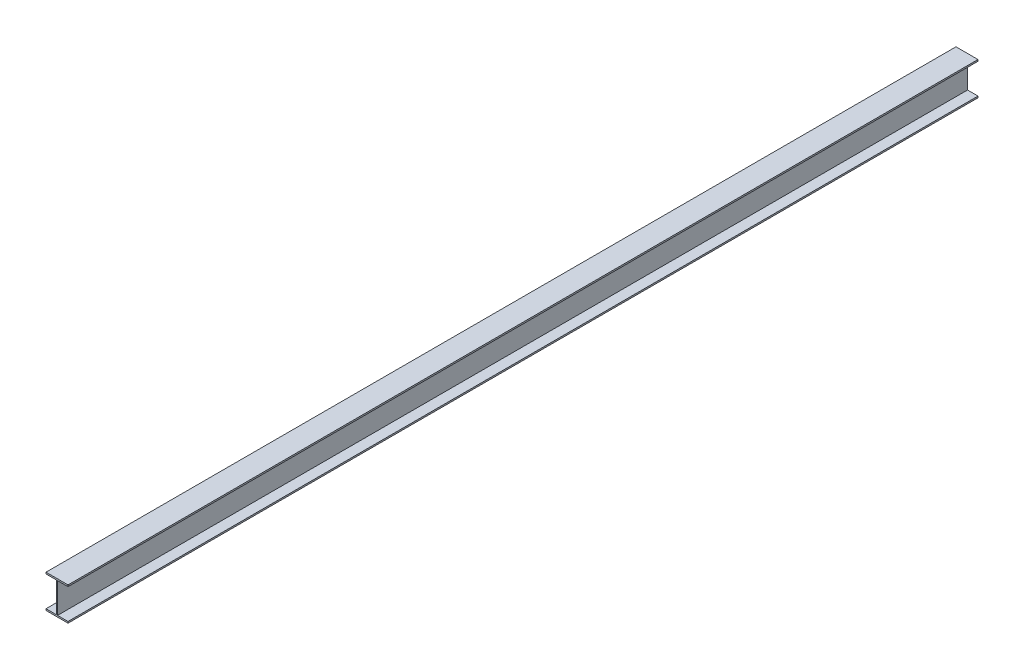
ISO-10303-21;
HEADER;
FILE_DESCRIPTION(('STEP AP214'),'2;1');
FILE_NAME('part.step','',(''),(''),'','','');
FILE_SCHEMA(('AUTOMOTIVE_DESIGN { 1 0 10303 214 1 1 1 1 }'));
ENDSEC;
DATA;
#1=APPLICATION_CONTEXT('core data for automotive mechanical design processes');
#2=APPLICATION_PROTOCOL_DEFINITION('international standard','automotive_design',2000,#1);
#3=PRODUCT_CONTEXT('',#1,'mechanical');
#4=PRODUCT('Part','Part','',(#3));
#5=PRODUCT_RELATED_PRODUCT_CATEGORY('part','',(#4));
#6=PRODUCT_DEFINITION_FORMATION('','',#4);
#7=PRODUCT_DEFINITION_CONTEXT('part definition',#1,'design');
#8=PRODUCT_DEFINITION('design','',#6,#7);
#9=PRODUCT_DEFINITION_SHAPE('','',#8);
#10=(LENGTH_UNIT() NAMED_UNIT(*) SI_UNIT(.MILLI.,.METRE.));
#11=(NAMED_UNIT(*) PLANE_ANGLE_UNIT() SI_UNIT($,.RADIAN.));
#12=(NAMED_UNIT(*) SI_UNIT($,.STERADIAN.) SOLID_ANGLE_UNIT());
#13=UNCERTAINTY_MEASURE_WITH_UNIT(LENGTH_MEASURE(1.E-05),#10,'distance_accuracy_value','');
#14=(GEOMETRIC_REPRESENTATION_CONTEXT(3) GLOBAL_UNCERTAINTY_ASSIGNED_CONTEXT((#13)) GLOBAL_UNIT_ASSIGNED_CONTEXT((#10,
#11,#12)) REPRESENTATION_CONTEXT('',''));
#15=CARTESIAN_POINT('',(0.,0.,0.));
#16=DIRECTION('',(0.,0.,1.));
#17=DIRECTION('',(1.,0.,0.));
#18=AXIS2_PLACEMENT_3D('',#15,#16,#17);
#19=CARTESIAN_POINT('',(101.6,-153.162240532958,4200.));
#20=DIRECTION('',(0.,1.,0.));
#21=DIRECTION('',(0.,0.,1.));
#22=AXIS2_PLACEMENT_3D('',#19,#20,#21);
#23=PLANE('',#22);
#24=DIRECTION('',(-1.,0.,0.));
#25=VECTOR('',#24,1.);
#26=CARTESIAN_POINT('',(101.6,-153.162240532958,2252.4));
#27=LINE('',#26,#25);
#28=CARTESIAN_POINT('',(101.6,-153.162240532958,2252.4));
#29=VERTEX_POINT('',#28);
#30=CARTESIAN_POINT('',(0.,-153.162240532958,2252.4));
#31=VERTEX_POINT('',#30);
#32=EDGE_CURVE('E11',#29,#31,#27,.T.);
#33=ORIENTED_EDGE('',*,*,#32,.F.);
#34=DIRECTION('',(0.,0.,-1.));
#35=VECTOR('',#34,1.);
#36=CARTESIAN_POINT('',(101.6,-153.162240532958,4200.));
#37=LINE('',#36,#35);
#38=CARTESIAN_POINT('',(101.6,-153.162240532958,4200.));
#39=VERTEX_POINT('',#38);
#40=EDGE_CURVE('E179',#39,#29,#37,.T.);
#41=ORIENTED_EDGE('',*,*,#40,.F.);
#42=DIRECTION('',(1.,0.,0.));
#43=VECTOR('',#42,1.);
#44=CARTESIAN_POINT('',(101.6,-153.162240532958,4200.));
#45=LINE('',#44,#43);
#46=CARTESIAN_POINT('',(0.,-153.162240532958,4200.));
#47=VERTEX_POINT('',#46);
#48=EDGE_CURVE('E236',#47,#39,#45,.T.);
#49=ORIENTED_EDGE('',*,*,#48,.F.);
#50=DIRECTION('',(0.,0.,-1.));
#51=VECTOR('',#50,1.);
#52=CARTESIAN_POINT('',(0.,-153.162240532958,4200.));
#53=LINE('',#52,#51);
#54=EDGE_CURVE('E174',#47,#31,#53,.T.);
#55=ORIENTED_EDGE('',*,*,#54,.T.);
#56=EDGE_LOOP('',(#33,#41,#49,#55));
#57=FACE_BOUND('',#56,.T.);
#58=ADVANCED_FACE('F37',(#57),#23,.F.);
#59=DIRECTION('',(1.,0.,0.));
#60=VECTOR('',#59,1.);
#61=CARTESIAN_POINT('',(101.6,-153.162240532958,1947.6));
#62=LINE('',#61,#60);
#63=CARTESIAN_POINT('',(0.,-153.162240532958,1947.6));
#64=VERTEX_POINT('',#63);
#65=CARTESIAN_POINT('',(101.6,-153.162240532958,1947.6));
#66=VERTEX_POINT('',#65);
#67=EDGE_CURVE('E46',#64,#66,#62,.T.);
#68=ORIENTED_EDGE('',*,*,#67,.F.);
#69=CARTESIAN_POINT('',(0.,-153.162240532958,0.));
#70=VERTEX_POINT('',#69);
#71=EDGE_CURVE('E178',#64,#70,#53,.T.);
#72=ORIENTED_EDGE('',*,*,#71,.T.);
#73=DIRECTION('',(1.,0.,0.));
#74=VECTOR('',#73,1.);
#75=CARTESIAN_POINT('',(101.6,-153.162240532958,0.));
#76=LINE('',#75,#74);
#77=CARTESIAN_POINT('',(101.6,-153.162240532958,0.));
#78=VERTEX_POINT('',#77);
#79=EDGE_CURVE('E212',#70,#78,#76,.T.);
#80=ORIENTED_EDGE('',*,*,#79,.T.);
#81=EDGE_CURVE('E183',#66,#78,#37,.T.);
#82=ORIENTED_EDGE('',*,*,#81,.F.);
#83=EDGE_LOOP('',(#68,#72,#80,#82));
#84=FACE_BOUND('',#83,.T.);
#85=ADVANCED_FACE('F294',(#84),#23,.F.);
#86=CARTESIAN_POINT('',(0.,-7.11224053295814,4200.));
#87=DIRECTION('',(1.,0.,0.));
#88=DIRECTION('',(0.,0.,-1.));
#89=AXIS2_PLACEMENT_3D('',#86,#87,#88);
#90=PLANE('',#89);
#91=DIRECTION('',(0.,-1.,0.));
#92=VECTOR('',#91,1.);
#93=CARTESIAN_POINT('',(0.,-7.11224053295814,0.));
#94=LINE('',#93,#92);
#95=CARTESIAN_POINT('',(0.,-0.000240532958142959,0.));
#96=VERTEX_POINT('',#95);
#97=CARTESIAN_POINT('',(0.,-7.11224053295814,0.));
#98=VERTEX_POINT('',#97);
#99=EDGE_CURVE('E163',#96,#98,#94,.T.);
#100=ORIENTED_EDGE('',*,*,#99,.T.);
#101=DIRECTION('',(0.,0.,-1.));
#102=VECTOR('',#101,1.);
#103=CARTESIAN_POINT('',(0.,-7.11224053295814,4200.));
#104=LINE('',#103,#102);
#105=CARTESIAN_POINT('',(0.,-7.11224053295814,4200.));
#106=VERTEX_POINT('',#105);
#107=EDGE_CURVE('E144',#106,#98,#104,.T.);
#108=ORIENTED_EDGE('',*,*,#107,.F.);
#109=DIRECTION('',(0.,-1.,0.));
#110=VECTOR('',#109,1.);
#111=CARTESIAN_POINT('',(0.,-7.11224053295814,4200.));
#112=LINE('',#111,#110);
#113=CARTESIAN_POINT('',(0.,-0.000240532958142959,4200.));
#114=VERTEX_POINT('',#113);
#115=EDGE_CURVE('E151',#114,#106,#112,.T.);
#116=ORIENTED_EDGE('',*,*,#115,.F.);
#117=DIRECTION('',(0.,0.,-1.));
#118=VECTOR('',#117,1.);
#119=CARTESIAN_POINT('',(0.,-0.000240532958142959,4200.));
#120=LINE('',#119,#118);
#121=EDGE_CURVE('E199',#114,#96,#120,.T.);
#122=ORIENTED_EDGE('',*,*,#121,.T.);
#123=EDGE_LOOP('',(#100,#108,#116,#122));
#124=FACE_BOUND('',#123,.T.);
#125=ADVANCED_FACE('F39',(#124),#90,.F.);
#126=CARTESIAN_POINT('',(47.5660357142857,-7.11224053295814,4200.));
#127=DIRECTION('',(0.,1.,0.));
#128=DIRECTION('',(-1.,0.,0.));
#129=AXIS2_PLACEMENT_3D('',#126,#127,#128);
#130=PLANE('',#129);
#131=DIRECTION('',(1.,0.,0.));
#132=VECTOR('',#131,1.);
#133=CARTESIAN_POINT('',(47.5660357142857,-7.11224053295814,0.));
#134=LINE('',#133,#132);
#135=CARTESIAN_POINT('',(47.5660357142857,-7.11224053295814,0.));
#136=VERTEX_POINT('',#135);
#137=EDGE_CURVE('E222',#98,#136,#134,.T.);
#138=ORIENTED_EDGE('',*,*,#137,.T.);
#139=DIRECTION('',(0.,0.,-1.));
#140=VECTOR('',#139,1.);
#141=CARTESIAN_POINT('',(47.5660357142857,-7.11224053295814,4200.));
#142=LINE('',#141,#140);
#143=CARTESIAN_POINT('',(47.5660357142857,-7.11224053295814,4200.));
#144=VERTEX_POINT('',#143);
#145=EDGE_CURVE('E147',#144,#136,#142,.T.);
#146=ORIENTED_EDGE('',*,*,#145,.F.);
#147=DIRECTION('',(1.,0.,0.));
#148=VECTOR('',#147,1.);
#149=CARTESIAN_POINT('',(47.5660357142857,-7.11224053295814,4200.));
#150=LINE('',#149,#148);
#151=EDGE_CURVE('E140',#106,#144,#150,.T.);
#152=ORIENTED_EDGE('',*,*,#151,.F.);
#153=ORIENTED_EDGE('',*,*,#107,.T.);
#154=EDGE_LOOP('',(#138,#146,#152,#153));
#155=FACE_BOUND('',#154,.T.);
#156=ADVANCED_FACE('F142',(#155),#130,.F.);
#157=CARTESIAN_POINT('',(47.5660357142857,-146.050240532958,4200.));
#158=DIRECTION('',(1.,0.,0.));
#159=DIRECTION('',(0.,0.,-1.));
#160=AXIS2_PLACEMENT_3D('',#157,#158,#159);
#161=PLANE('',#160);
#162=DIRECTION('',(0.,-1.,0.));
#163=VECTOR('',#162,1.);
#164=CARTESIAN_POINT('',(47.5660357142857,-146.050240532958,0.));
#165=LINE('',#164,#163);
#166=CARTESIAN_POINT('',(47.5660357142857,-146.050240532958,0.));
#167=VERTEX_POINT('',#166);
#168=EDGE_CURVE('E220',#136,#167,#165,.T.);
#169=ORIENTED_EDGE('',*,*,#168,.T.);
#170=DIRECTION('',(0.,0.,-1.));
#171=VECTOR('',#170,1.);
#172=CARTESIAN_POINT('',(47.5660357142857,-146.050240532958,4200.));
#173=LINE('',#172,#171);
#174=CARTESIAN_POINT('',(47.5660357142857,-146.050240532958,4200.));
#175=VERTEX_POINT('',#174);
#176=EDGE_CURVE('E166',#175,#167,#173,.T.);
#177=ORIENTED_EDGE('',*,*,#176,.F.);
#178=DIRECTION('',(0.,-1.,0.));
#179=VECTOR('',#178,1.);
#180=CARTESIAN_POINT('',(47.5660357142857,-146.050240532958,4200.));
#181=LINE('',#180,#179);
#182=EDGE_CURVE('E150',#144,#175,#181,.T.);
#183=ORIENTED_EDGE('',*,*,#182,.F.);
#184=ORIENTED_EDGE('',*,*,#145,.T.);
#185=EDGE_LOOP('',(#169,#177,#183,#184));
#186=FACE_BOUND('',#185,.T.);
#187=ADVANCED_FACE('F246',(#186),#161,.F.);
#188=CARTESIAN_POINT('',(0.,-146.050240532958,4200.));
#189=DIRECTION('',(0.,-1.,0.));
#190=DIRECTION('',(1.,0.,0.));
#191=AXIS2_PLACEMENT_3D('',#188,#189,#190);
#192=PLANE('',#191);
#193=DIRECTION('',(-1.,0.,0.));
#194=VECTOR('',#193,1.);
#195=CARTESIAN_POINT('',(0.,-146.050240532958,0.));
#196=LINE('',#195,#194);
#197=CARTESIAN_POINT('',(0.,-146.050240532958,0.));
#198=VERTEX_POINT('',#197);
#199=EDGE_CURVE('E218',#167,#198,#196,.T.);
#200=ORIENTED_EDGE('',*,*,#199,.T.);
#201=DIRECTION('',(0.,0.,-1.));
#202=VECTOR('',#201,1.);
#203=CARTESIAN_POINT('',(0.,-146.050240532958,4200.));
#204=LINE('',#203,#202);
#205=CARTESIAN_POINT('',(0.,-146.050240532958,4200.));
#206=VERTEX_POINT('',#205);
#207=EDGE_CURVE('E171',#206,#198,#204,.T.);
#208=ORIENTED_EDGE('',*,*,#207,.F.);
#209=DIRECTION('',(-1.,0.,0.));
#210=VECTOR('',#209,1.);
#211=CARTESIAN_POINT('',(0.,-146.050240532958,4200.));
#212=LINE('',#211,#210);
#213=EDGE_CURVE('E240',#175,#206,#212,.T.);
#214=ORIENTED_EDGE('',*,*,#213,.F.);
#215=ORIENTED_EDGE('',*,*,#176,.T.);
#216=EDGE_LOOP('',(#200,#208,#214,#215));
#217=FACE_BOUND('',#216,.T.);
#218=ADVANCED_FACE('F250',(#217),#192,.F.);
#219=CARTESIAN_POINT('',(0.,-153.162240532958,4200.));
#220=DIRECTION('',(1.,0.,0.));
#221=DIRECTION('',(0.,0.,-1.));
#222=AXIS2_PLACEMENT_3D('',#219,#220,#221);
#223=PLANE('',#222);
#224=DIRECTION('',(0.,-1.,0.));
#225=VECTOR('',#224,1.);
#226=CARTESIAN_POINT('',(0.,-153.162240532958,0.));
#227=LINE('',#226,#225);
#228=EDGE_CURVE('E215',#198,#70,#227,.T.);
#229=ORIENTED_EDGE('',*,*,#228,.T.);
#230=ORIENTED_EDGE('',*,*,#71,.F.);
#231=EDGE_CURVE('E177',#31,#64,#53,.T.);
#232=ORIENTED_EDGE('',*,*,#231,.F.);
#233=ORIENTED_EDGE('',*,*,#54,.F.);
#234=DIRECTION('',(0.,-1.,0.));
#235=VECTOR('',#234,1.);
#236=CARTESIAN_POINT('',(0.,-153.162240532958,4200.));
#237=LINE('',#236,#235);
#238=EDGE_CURVE('E238',#206,#47,#237,.T.);
#239=ORIENTED_EDGE('',*,*,#238,.F.);
#240=ORIENTED_EDGE('',*,*,#207,.T.);
#241=EDGE_LOOP('',(#229,#230,#232,#233,#239,#240));
#242=FACE_BOUND('',#241,.T.);
#243=ADVANCED_FACE('F255',(#242),#223,.F.);
#244=CARTESIAN_POINT('',(101.6,-153.162240532958,2100.));
#245=VERTEX_POINT('',#244);
#246=EDGE_CURVE('E182',#29,#245,#37,.T.);
#247=ORIENTED_EDGE('',*,*,#246,.F.);
#248=ORIENTED_EDGE('',*,*,#32,.T.);
#249=ORIENTED_EDGE('',*,*,#231,.T.);
#250=ORIENTED_EDGE('',*,*,#67,.T.);
#251=EDGE_CURVE('E293',#245,#66,#37,.T.);
#252=ORIENTED_EDGE('',*,*,#251,.F.);
#253=EDGE_LOOP('',(#247,#248,#249,#250,#252));
#254=FACE_BOUND('',#253,.T.);
#255=ADVANCED_FACE('F291',(#254),#23,.F.);
#256=CARTESIAN_POINT('',(101.6,-146.050240532958,4200.));
#257=DIRECTION('',(-1.,0.,0.));
#258=DIRECTION('',(0.,0.,1.));
#259=AXIS2_PLACEMENT_3D('',#256,#257,#258);
#260=PLANE('',#259);
#261=DIRECTION('',(0.,1.,0.));
#262=VECTOR('',#261,1.);
#263=CARTESIAN_POINT('',(101.6,-146.050240532958,0.));
#264=LINE('',#263,#262);
#265=CARTESIAN_POINT('',(101.6,-146.050240532958,0.));
#266=VERTEX_POINT('',#265);
#267=EDGE_CURVE('E210',#78,#266,#264,.T.);
#268=ORIENTED_EDGE('',*,*,#267,.T.);
#269=DIRECTION('',(0.,0.,-1.));
#270=VECTOR('',#269,1.);
#271=CARTESIAN_POINT('',(101.6,-146.050240532958,4200.));
#272=LINE('',#271,#270);
#273=CARTESIAN_POINT('',(101.6,-146.050240532958,4200.));
#274=VERTEX_POINT('',#273);
#275=EDGE_CURVE('E184',#274,#266,#272,.T.);
#276=ORIENTED_EDGE('',*,*,#275,.F.);
#277=DIRECTION('',(0.,1.,0.));
#278=VECTOR('',#277,1.);
#279=CARTESIAN_POINT('',(101.6,-146.050240532958,4200.));
#280=LINE('',#279,#278);
#281=EDGE_CURVE('E234',#39,#274,#280,.T.);
#282=ORIENTED_EDGE('',*,*,#281,.F.);
#283=ORIENTED_EDGE('',*,*,#40,.T.);
#284=ORIENTED_EDGE('',*,*,#246,.T.);
#285=ORIENTED_EDGE('',*,*,#251,.T.);
#286=ORIENTED_EDGE('',*,*,#81,.T.);
#287=EDGE_LOOP('',(#268,#276,#282,#283,#284,#285,#286));
#288=FACE_BOUND('',#287,.T.);
#289=ADVANCED_FACE('F263',(#288),#260,.F.);
#290=CARTESIAN_POINT('',(53.4080357142857,-146.050240532958,4200.));
#291=DIRECTION('',(0.,-1.,0.));
#292=DIRECTION('',(1.,0.,0.));
#293=AXIS2_PLACEMENT_3D('',#290,#291,#292);
#294=PLANE('',#293);
#295=DIRECTION('',(-1.,0.,0.));
#296=VECTOR('',#295,1.);
#297=CARTESIAN_POINT('',(53.4080357142857,-146.050240532958,0.));
#298=LINE('',#297,#296);
#299=CARTESIAN_POINT('',(53.4080357142857,-146.050240532958,0.));
#300=VERTEX_POINT('',#299);
#301=EDGE_CURVE('E208',#266,#300,#298,.T.);
#302=ORIENTED_EDGE('',*,*,#301,.T.);
#303=DIRECTION('',(0.,0.,-1.));
#304=VECTOR('',#303,1.);
#305=CARTESIAN_POINT('',(53.4080357142857,-146.050240532958,4200.));
#306=LINE('',#305,#304);
#307=CARTESIAN_POINT('',(53.4080357142857,-146.050240532958,4200.));
#308=VERTEX_POINT('',#307);
#309=EDGE_CURVE('E187',#308,#300,#306,.T.);
#310=ORIENTED_EDGE('',*,*,#309,.F.);
#311=DIRECTION('',(-1.,0.,0.));
#312=VECTOR('',#311,1.);
#313=CARTESIAN_POINT('',(53.4080357142857,-146.050240532958,4200.));
#314=LINE('',#313,#312);
#315=EDGE_CURVE('E232',#274,#308,#314,.T.);
#316=ORIENTED_EDGE('',*,*,#315,.F.);
#317=ORIENTED_EDGE('',*,*,#275,.T.);
#318=EDGE_LOOP('',(#302,#310,#316,#317));
#319=FACE_BOUND('',#318,.T.);
#320=ADVANCED_FACE('F269',(#319),#294,.F.);
#321=CARTESIAN_POINT('',(53.4080357142857,-7.11224053295815,4200.));
#322=DIRECTION('',(-1.,0.,0.));
#323=DIRECTION('',(0.,-1.,0.));
#324=AXIS2_PLACEMENT_3D('',#321,#322,#323);
#325=PLANE('',#324);
#326=DIRECTION('',(0.,1.,0.));
#327=VECTOR('',#326,1.);
#328=CARTESIAN_POINT('',(53.4080357142857,-7.11224053295815,0.));
#329=LINE('',#328,#327);
#330=CARTESIAN_POINT('',(53.4080357142857,-7.11224053295815,0.));
#331=VERTEX_POINT('',#330);
#332=EDGE_CURVE('E206',#300,#331,#329,.T.);
#333=ORIENTED_EDGE('',*,*,#332,.T.);
#334=DIRECTION('',(0.,0.,-1.));
#335=VECTOR('',#334,1.);
#336=CARTESIAN_POINT('',(53.4080357142857,-7.11224053295815,4200.));
#337=LINE('',#336,#335);
#338=CARTESIAN_POINT('',(53.4080357142857,-7.11224053295815,4200.));
#339=VERTEX_POINT('',#338);
#340=EDGE_CURVE('E190',#339,#331,#337,.T.);
#341=ORIENTED_EDGE('',*,*,#340,.F.);
#342=DIRECTION('',(0.,1.,0.));
#343=VECTOR('',#342,1.);
#344=CARTESIAN_POINT('',(53.4080357142857,-7.11224053295815,4200.));
#345=LINE('',#344,#343);
#346=EDGE_CURVE('E230',#308,#339,#345,.T.);
#347=ORIENTED_EDGE('',*,*,#346,.F.);
#348=ORIENTED_EDGE('',*,*,#309,.T.);
#349=EDGE_LOOP('',(#333,#341,#347,#348));
#350=FACE_BOUND('',#349,.T.);
#351=ADVANCED_FACE('F275',(#350),#325,.F.);
#352=CARTESIAN_POINT('',(101.6,-7.11224053295814,4200.));
#353=DIRECTION('',(0.,1.,0.));
#354=DIRECTION('',(-1.,0.,0.));
#355=AXIS2_PLACEMENT_3D('',#352,#353,#354);
#356=PLANE('',#355);
#357=DIRECTION('',(1.,0.,0.));
#358=VECTOR('',#357,1.);
#359=CARTESIAN_POINT('',(101.6,-7.11224053295814,0.));
#360=LINE('',#359,#358);
#361=CARTESIAN_POINT('',(101.6,-7.11224053295814,0.));
#362=VERTEX_POINT('',#361);
#363=EDGE_CURVE('E204',#331,#362,#360,.T.);
#364=ORIENTED_EDGE('',*,*,#363,.T.);
#365=DIRECTION('',(0.,0.,-1.));
#366=VECTOR('',#365,1.);
#367=CARTESIAN_POINT('',(101.6,-7.11224053295814,4200.));
#368=LINE('',#367,#366);
#369=CARTESIAN_POINT('',(101.6,-7.11224053295814,4200.));
#370=VERTEX_POINT('',#369);
#371=EDGE_CURVE('E193',#370,#362,#368,.T.);
#372=ORIENTED_EDGE('',*,*,#371,.F.);
#373=DIRECTION('',(1.,0.,0.));
#374=VECTOR('',#373,1.);
#375=CARTESIAN_POINT('',(101.6,-7.11224053295814,4200.));
#376=LINE('',#375,#374);
#377=EDGE_CURVE('E228',#339,#370,#376,.T.);
#378=ORIENTED_EDGE('',*,*,#377,.F.);
#379=ORIENTED_EDGE('',*,*,#340,.T.);
#380=EDGE_LOOP('',(#364,#372,#378,#379));
#381=FACE_BOUND('',#380,.T.);
#382=ADVANCED_FACE('F279',(#381),#356,.F.);
#383=CARTESIAN_POINT('',(101.6,-0.000240532958130516,4200.));
#384=DIRECTION('',(-1.,0.,0.));
#385=DIRECTION('',(0.,0.,1.));
#386=AXIS2_PLACEMENT_3D('',#383,#384,#385);
#387=PLANE('',#386);
#388=DIRECTION('',(0.,1.,0.));
#389=VECTOR('',#388,1.);
#390=CARTESIAN_POINT('',(101.6,-0.000240532958130516,0.));
#391=LINE('',#390,#389);
#392=CARTESIAN_POINT('',(101.6,-0.000240532958130516,0.));
#393=VERTEX_POINT('',#392);
#394=EDGE_CURVE('E202',#362,#393,#391,.T.);
#395=ORIENTED_EDGE('',*,*,#394,.T.);
#396=DIRECTION('',(0.,0.,-1.));
#397=VECTOR('',#396,1.);
#398=CARTESIAN_POINT('',(101.6,-0.000240532958130516,4200.));
#399=LINE('',#398,#397);
#400=CARTESIAN_POINT('',(101.6,-0.000240532958130516,4200.));
#401=VERTEX_POINT('',#400);
#402=EDGE_CURVE('E196',#401,#393,#399,.T.);
#403=ORIENTED_EDGE('',*,*,#402,.F.);
#404=DIRECTION('',(0.,1.,0.));
#405=VECTOR('',#404,1.);
#406=CARTESIAN_POINT('',(101.6,-0.000240532958130516,4200.));
#407=LINE('',#406,#405);
#408=EDGE_CURVE('E226',#370,#401,#407,.T.);
#409=ORIENTED_EDGE('',*,*,#408,.F.);
#410=ORIENTED_EDGE('',*,*,#371,.T.);
#411=EDGE_LOOP('',(#395,#403,#409,#410));
#412=FACE_BOUND('',#411,.T.);
#413=ADVANCED_FACE('F284',(#412),#387,.F.);
#414=CARTESIAN_POINT('',(0.,-0.000240532958142959,4200.));
#415=DIRECTION('',(0.,-1.,0.));
#416=DIRECTION('',(1.,0.,0.));
#417=AXIS2_PLACEMENT_3D('',#414,#415,#416);
#418=PLANE('',#417);
#419=DIRECTION('',(-1.,0.,0.));
#420=VECTOR('',#419,1.);
#421=CARTESIAN_POINT('',(0.,-0.000240532958142959,0.));
#422=LINE('',#421,#420);
#423=EDGE_CURVE('E160',#393,#96,#422,.T.);
#424=ORIENTED_EDGE('',*,*,#423,.T.);
#425=ORIENTED_EDGE('',*,*,#121,.F.);
#426=DIRECTION('',(-1.,0.,0.));
#427=VECTOR('',#426,1.);
#428=CARTESIAN_POINT('',(0.,-0.000240532958142959,4200.));
#429=LINE('',#428,#427);
#430=EDGE_CURVE('E156',#401,#114,#429,.T.);
#431=ORIENTED_EDGE('',*,*,#430,.F.);
#432=ORIENTED_EDGE('',*,*,#402,.T.);
#433=EDGE_LOOP('',(#424,#425,#431,#432));
#434=FACE_BOUND('',#433,.T.);
#435=ADVANCED_FACE('F287',(#434),#418,.F.);
#436=CARTESIAN_POINT('',(0.,0.,4200.));
#437=DIRECTION('',(0.,0.,-1.));
#438=DIRECTION('',(-1.,0.,0.));
#439=AXIS2_PLACEMENT_3D('',#436,#437,#438);
#440=PLANE('',#439);
#441=ORIENTED_EDGE('',*,*,#115,.T.);
#442=ORIENTED_EDGE('',*,*,#151,.T.);
#443=ORIENTED_EDGE('',*,*,#182,.T.);
#444=ORIENTED_EDGE('',*,*,#213,.T.);
#445=ORIENTED_EDGE('',*,*,#238,.T.);
#446=ORIENTED_EDGE('',*,*,#48,.T.);
#447=ORIENTED_EDGE('',*,*,#281,.T.);
#448=ORIENTED_EDGE('',*,*,#315,.T.);
#449=ORIENTED_EDGE('',*,*,#346,.T.);
#450=ORIENTED_EDGE('',*,*,#377,.T.);
#451=ORIENTED_EDGE('',*,*,#408,.T.);
#452=ORIENTED_EDGE('',*,*,#430,.T.);
#453=EDGE_LOOP('',(#441,#442,#443,#444,#445,#446,#447,#448,#449,#450,#451,#452));
#454=FACE_BOUND('',#453,.T.);
#455=ADVANCED_FACE('F154',(#454),#440,.F.);
#456=CARTESIAN_POINT('',(0.,0.,0.));
#457=DIRECTION('',(0.,0.,-1.));
#458=DIRECTION('',(-1.,0.,0.));
#459=AXIS2_PLACEMENT_3D('',#456,#457,#458);
#460=PLANE('',#459);
#461=ORIENTED_EDGE('',*,*,#99,.F.);
#462=ORIENTED_EDGE('',*,*,#423,.F.);
#463=ORIENTED_EDGE('',*,*,#394,.F.);
#464=ORIENTED_EDGE('',*,*,#363,.F.);
#465=ORIENTED_EDGE('',*,*,#332,.F.);
#466=ORIENTED_EDGE('',*,*,#301,.F.);
#467=ORIENTED_EDGE('',*,*,#267,.F.);
#468=ORIENTED_EDGE('',*,*,#79,.F.);
#469=ORIENTED_EDGE('',*,*,#228,.F.);
#470=ORIENTED_EDGE('',*,*,#199,.F.);
#471=ORIENTED_EDGE('',*,*,#168,.F.);
#472=ORIENTED_EDGE('',*,*,#137,.F.);
#473=EDGE_LOOP('',(#461,#462,#463,#464,#465,#466,#467,#468,#469,#470,#471,#472));
#474=FACE_BOUND('',#473,.T.);
#475=ADVANCED_FACE('F289',(#474),#460,.T.);
#476=CLOSED_SHELL('',(#58,#85,#125,#156,#187,#218,#243,#255,#289,#320,#351,#382,#413,#435,#455,#475));
#477=MANIFOLD_SOLID_BREP('B2',#476);
#478=ADVANCED_BREP_SHAPE_REPRESENTATION('',(#18,#477),#14);
#479=SHAPE_DEFINITION_REPRESENTATION(#9,#478);
ENDSEC;
END-ISO-10303-21;
